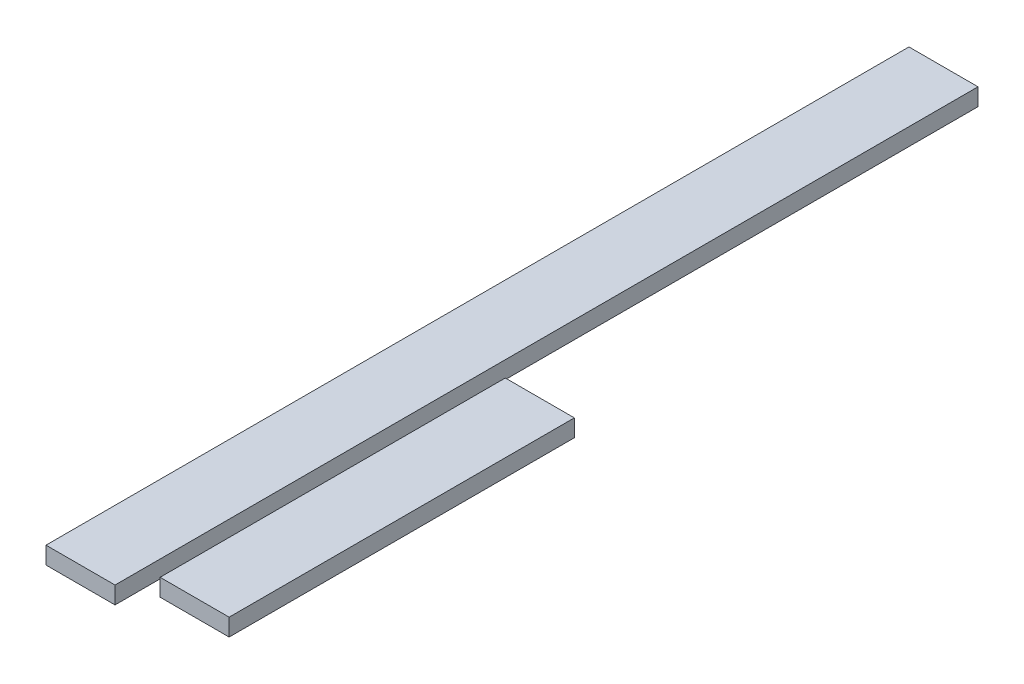
ISO-10303-21;
HEADER;
FILE_DESCRIPTION(('STEP AP214'),'2;1');
FILE_NAME('part.step','',(''),(''),'','','');
FILE_SCHEMA(('AUTOMOTIVE_DESIGN { 1 0 10303 214 1 1 1 1 }'));
ENDSEC;
DATA;
#1=APPLICATION_CONTEXT('core data for automotive mechanical design processes');
#2=APPLICATION_PROTOCOL_DEFINITION('international standard','automotive_design',2000,#1);
#3=PRODUCT_CONTEXT('',#1,'mechanical');
#4=PRODUCT('Part','Part','',(#3));
#5=PRODUCT_RELATED_PRODUCT_CATEGORY('part','',(#4));
#6=PRODUCT_DEFINITION_FORMATION('','',#4);
#7=PRODUCT_DEFINITION_CONTEXT('part definition',#1,'design');
#8=PRODUCT_DEFINITION('design','',#6,#7);
#9=PRODUCT_DEFINITION_SHAPE('','',#8);
#10=(LENGTH_UNIT() NAMED_UNIT(*) SI_UNIT(.MILLI.,.METRE.));
#11=(NAMED_UNIT(*) PLANE_ANGLE_UNIT() SI_UNIT($,.RADIAN.));
#12=(NAMED_UNIT(*) SI_UNIT($,.STERADIAN.) SOLID_ANGLE_UNIT());
#13=UNCERTAINTY_MEASURE_WITH_UNIT(LENGTH_MEASURE(1.E-05),#10,'distance_accuracy_value','');
#14=(GEOMETRIC_REPRESENTATION_CONTEXT(3) GLOBAL_UNCERTAINTY_ASSIGNED_CONTEXT((#13)) GLOBAL_UNIT_ASSIGNED_CONTEXT((#10,
#11,#12)) REPRESENTATION_CONTEXT('',''));
#15=CARTESIAN_POINT('',(0.,0.,0.));
#16=DIRECTION('',(0.,0.,1.));
#17=DIRECTION('',(1.,0.,0.));
#18=AXIS2_PLACEMENT_3D('',#15,#16,#17);
#19=CARTESIAN_POINT('',(72.5920918701177,3.,-81.6506583305544));
#20=DIRECTION('',(1.,0.,0.));
#21=DIRECTION('',(0.,0.,-1.));
#22=AXIS2_PLACEMENT_3D('',#19,#20,#21);
#23=PLANE('',#22);
#24=DIRECTION('',(0.,0.,1.));
#25=VECTOR('',#24,1.);
#26=CARTESIAN_POINT('',(72.5920918701177,0.,-81.6506583305544));
#27=LINE('',#26,#25);
#28=CARTESIAN_POINT('',(72.5920918701177,0.,-81.6506583305544));
#29=VERTEX_POINT('',#28);
#30=CARTESIAN_POINT('',(72.5920918701177,0.,-21.6506583305544));
#31=VERTEX_POINT('',#30);
#32=EDGE_CURVE('E106',#29,#31,#27,.T.);
#33=ORIENTED_EDGE('',*,*,#32,.T.);
#34=DIRECTION('',(0.,-1.,0.));
#35=VECTOR('',#34,1.);
#36=CARTESIAN_POINT('',(72.5920918701177,3.,-21.6506583305544));
#37=LINE('',#36,#35);
#38=CARTESIAN_POINT('',(72.5920918701177,3.,-21.6506583305544));
#39=VERTEX_POINT('',#38);
#40=EDGE_CURVE('E12',#39,#31,#37,.T.);
#41=ORIENTED_EDGE('',*,*,#40,.F.);
#42=DIRECTION('',(0.,0.,1.));
#43=VECTOR('',#42,1.);
#44=CARTESIAN_POINT('',(72.5920918701177,3.,-81.6506583305544));
#45=LINE('',#44,#43);
#46=CARTESIAN_POINT('',(72.5920918701177,3.,-81.6506583305544));
#47=VERTEX_POINT('',#46);
#48=EDGE_CURVE('E94',#47,#39,#45,.T.);
#49=ORIENTED_EDGE('',*,*,#48,.F.);
#50=DIRECTION('',(0.,-1.,0.));
#51=VECTOR('',#50,1.);
#52=CARTESIAN_POINT('',(72.5920918701177,3.,-81.6506583305544));
#53=LINE('',#52,#51);
#54=EDGE_CURVE('E102',#47,#29,#53,.T.);
#55=ORIENTED_EDGE('',*,*,#54,.T.);
#56=EDGE_LOOP('',(#33,#41,#49,#55));
#57=FACE_BOUND('',#56,.T.);
#58=ADVANCED_FACE('F43',(#57),#23,.F.);
#59=CARTESIAN_POINT('',(72.5920918701177,3.,-21.6506583305544));
#60=DIRECTION('',(0.,0.,-1.));
#61=DIRECTION('',(-1.,0.,0.));
#62=AXIS2_PLACEMENT_3D('',#59,#60,#61);
#63=PLANE('',#62);
#64=DIRECTION('',(1.,0.,0.));
#65=VECTOR('',#64,1.);
#66=CARTESIAN_POINT('',(72.5920918701177,0.,-21.6506583305544));
#67=LINE('',#66,#65);
#68=CARTESIAN_POINT('',(84.5920918701177,0.,-21.6506583305544));
#69=VERTEX_POINT('',#68);
#70=EDGE_CURVE('E98',#31,#69,#67,.T.);
#71=ORIENTED_EDGE('',*,*,#70,.T.);
#72=DIRECTION('',(0.,-1.,0.));
#73=VECTOR('',#72,1.);
#74=CARTESIAN_POINT('',(84.5920918701177,3.,-21.6506583305544));
#75=LINE('',#74,#73);
#76=CARTESIAN_POINT('',(84.5920918701177,3.,-21.6506583305544));
#77=VERTEX_POINT('',#76);
#78=EDGE_CURVE('E51',#77,#69,#75,.T.);
#79=ORIENTED_EDGE('',*,*,#78,.F.);
#80=DIRECTION('',(1.,0.,0.));
#81=VECTOR('',#80,1.);
#82=CARTESIAN_POINT('',(72.5920918701177,3.,-21.6506583305544));
#83=LINE('',#82,#81);
#84=EDGE_CURVE('E89',#39,#77,#83,.T.);
#85=ORIENTED_EDGE('',*,*,#84,.F.);
#86=ORIENTED_EDGE('',*,*,#40,.T.);
#87=EDGE_LOOP('',(#71,#79,#85,#86));
#88=FACE_BOUND('',#87,.T.);
#89=ADVANCED_FACE('F97',(#88),#63,.F.);
#90=CARTESIAN_POINT('',(84.5920918701177,3.,-81.6506583305544));
#91=DIRECTION('',(-1.,0.,0.));
#92=DIRECTION('',(0.,0.,1.));
#93=AXIS2_PLACEMENT_3D('',#90,#91,#92);
#94=PLANE('',#93);
#95=DIRECTION('',(0.,0.,-1.));
#96=VECTOR('',#95,1.);
#97=CARTESIAN_POINT('',(84.5920918701177,0.,-81.6506583305544));
#98=LINE('',#97,#96);
#99=CARTESIAN_POINT('',(84.5920918701177,0.,-81.6506583305544));
#100=VERTEX_POINT('',#99);
#101=EDGE_CURVE('E76',#69,#100,#98,.T.);
#102=ORIENTED_EDGE('',*,*,#101,.T.);
#103=DIRECTION('',(0.,-1.,0.));
#104=VECTOR('',#103,1.);
#105=CARTESIAN_POINT('',(84.5920918701177,3.,-81.6506583305544));
#106=LINE('',#105,#104);
#107=CARTESIAN_POINT('',(84.5920918701177,3.,-81.6506583305544));
#108=VERTEX_POINT('',#107);
#109=EDGE_CURVE('E99',#108,#100,#106,.T.);
#110=ORIENTED_EDGE('',*,*,#109,.F.);
#111=DIRECTION('',(0.,0.,-1.));
#112=VECTOR('',#111,1.);
#113=CARTESIAN_POINT('',(84.5920918701177,3.,-81.6506583305544));
#114=LINE('',#113,#112);
#115=EDGE_CURVE('E92',#77,#108,#114,.T.);
#116=ORIENTED_EDGE('',*,*,#115,.F.);
#117=ORIENTED_EDGE('',*,*,#78,.T.);
#118=EDGE_LOOP('',(#102,#110,#116,#117));
#119=FACE_BOUND('',#118,.T.);
#120=ADVANCED_FACE('F100',(#119),#94,.F.);
#121=CARTESIAN_POINT('',(72.5920918701177,3.,-81.6506583305544));
#122=DIRECTION('',(0.,0.,1.));
#123=DIRECTION('',(1.,0.,0.));
#124=AXIS2_PLACEMENT_3D('',#121,#122,#123);
#125=PLANE('',#124);
#126=DIRECTION('',(-1.,0.,0.));
#127=VECTOR('',#126,1.);
#128=CARTESIAN_POINT('',(72.5920918701177,0.,-81.6506583305544));
#129=LINE('',#128,#127);
#130=EDGE_CURVE('E82',#100,#29,#129,.T.);
#131=ORIENTED_EDGE('',*,*,#130,.T.);
#132=ORIENTED_EDGE('',*,*,#54,.F.);
#133=DIRECTION('',(-1.,0.,0.));
#134=VECTOR('',#133,1.);
#135=CARTESIAN_POINT('',(72.5920918701177,3.,-81.6506583305544));
#136=LINE('',#135,#134);
#137=EDGE_CURVE('E59',#108,#47,#136,.T.);
#138=ORIENTED_EDGE('',*,*,#137,.F.);
#139=ORIENTED_EDGE('',*,*,#109,.T.);
#140=EDGE_LOOP('',(#131,#132,#138,#139));
#141=FACE_BOUND('',#140,.T.);
#142=ADVANCED_FACE('F113',(#141),#125,.F.);
#143=CARTESIAN_POINT('',(-21.0374683043508,3.,-8.38383851009602));
#144=DIRECTION('',(0.,1.,0.));
#145=DIRECTION('',(0.,0.,1.));
#146=AXIS2_PLACEMENT_3D('',#143,#144,#145);
#147=PLANE('',#146);
#148=ORIENTED_EDGE('',*,*,#48,.T.);
#149=ORIENTED_EDGE('',*,*,#84,.T.);
#150=ORIENTED_EDGE('',*,*,#115,.T.);
#151=ORIENTED_EDGE('',*,*,#137,.T.);
#152=EDGE_LOOP('',(#148,#149,#150,#151));
#153=FACE_BOUND('',#152,.T.);
#154=ADVANCED_FACE('F90',(#153),#147,.T.);
#155=CARTESIAN_POINT('',(-21.0374683043508,0.,-8.38383851009602));
#156=DIRECTION('',(0.,1.,0.));
#157=DIRECTION('',(0.,0.,1.));
#158=AXIS2_PLACEMENT_3D('',#155,#156,#157);
#159=PLANE('',#158);
#160=ORIENTED_EDGE('',*,*,#32,.F.);
#161=ORIENTED_EDGE('',*,*,#130,.F.);
#162=ORIENTED_EDGE('',*,*,#101,.F.);
#163=ORIENTED_EDGE('',*,*,#70,.F.);
#164=EDGE_LOOP('',(#160,#161,#162,#163));
#165=FACE_BOUND('',#164,.T.);
#166=ADVANCED_FACE('F116',(#165),#159,.F.);
#167=CLOSED_SHELL('',(#58,#89,#120,#142,#154,#166));
#168=MANIFOLD_SOLID_BREP('B2',#167);
#169=CARTESIAN_POINT('',(57.8362578566196,3.,-166.571847269674));
#170=DIRECTION('',(1.,0.,0.));
#171=DIRECTION('',(0.,0.,-1.));
#172=AXIS2_PLACEMENT_3D('',#169,#170,#171);
#173=PLANE('',#172);
#174=DIRECTION('',(0.,0.,1.));
#175=VECTOR('',#174,1.);
#176=CARTESIAN_POINT('',(57.8362578566196,0.,-166.571847269674));
#177=LINE('',#176,#175);
#178=CARTESIAN_POINT('',(57.8362578566196,0.,-166.571847269674));
#179=VERTEX_POINT('',#178);
#180=CARTESIAN_POINT('',(57.8362578566196,0.,-16.5718472696739));
#181=VERTEX_POINT('',#180);
#182=EDGE_CURVE('E230',#179,#181,#177,.T.);
#183=ORIENTED_EDGE('',*,*,#182,.T.);
#184=DIRECTION('',(0.,-1.,0.));
#185=VECTOR('',#184,1.);
#186=CARTESIAN_POINT('',(57.8362578566196,3.,-16.5718472696739));
#187=LINE('',#186,#185);
#188=CARTESIAN_POINT('',(57.8362578566196,3.,-16.5718472696739));
#189=VERTEX_POINT('',#188);
#190=EDGE_CURVE('E41',#189,#181,#187,.T.);
#191=ORIENTED_EDGE('',*,*,#190,.F.);
#192=DIRECTION('',(0.,0.,1.));
#193=VECTOR('',#192,1.);
#194=CARTESIAN_POINT('',(57.8362578566196,3.,-166.571847269674));
#195=LINE('',#194,#193);
#196=CARTESIAN_POINT('',(57.8362578566196,3.,-166.571847269674));
#197=VERTEX_POINT('',#196);
#198=EDGE_CURVE('E218',#197,#189,#195,.T.);
#199=ORIENTED_EDGE('',*,*,#198,.F.);
#200=DIRECTION('',(0.,-1.,0.));
#201=VECTOR('',#200,1.);
#202=CARTESIAN_POINT('',(57.8362578566196,3.,-166.571847269674));
#203=LINE('',#202,#201);
#204=EDGE_CURVE('E226',#197,#179,#203,.T.);
#205=ORIENTED_EDGE('',*,*,#204,.T.);
#206=EDGE_LOOP('',(#183,#191,#199,#205));
#207=FACE_BOUND('',#206,.T.);
#208=ADVANCED_FACE('F167',(#207),#173,.F.);
#209=CARTESIAN_POINT('',(57.8362578566196,3.,-16.5718472696739));
#210=DIRECTION('',(0.,0.,-1.));
#211=DIRECTION('',(-1.,0.,0.));
#212=AXIS2_PLACEMENT_3D('',#209,#210,#211);
#213=PLANE('',#212);
#214=DIRECTION('',(1.,0.,0.));
#215=VECTOR('',#214,1.);
#216=CARTESIAN_POINT('',(57.8362578566196,0.,-16.5718472696739));
#217=LINE('',#216,#215);
#218=CARTESIAN_POINT('',(69.8362578566196,0.,-16.5718472696739));
#219=VERTEX_POINT('',#218);
#220=EDGE_CURVE('E222',#181,#219,#217,.T.);
#221=ORIENTED_EDGE('',*,*,#220,.T.);
#222=DIRECTION('',(0.,-1.,0.));
#223=VECTOR('',#222,1.);
#224=CARTESIAN_POINT('',(69.8362578566196,3.,-16.5718472696739));
#225=LINE('',#224,#223);
#226=CARTESIAN_POINT('',(69.8362578566196,3.,-16.5718472696739));
#227=VERTEX_POINT('',#226);
#228=EDGE_CURVE('E175',#227,#219,#225,.T.);
#229=ORIENTED_EDGE('',*,*,#228,.F.);
#230=DIRECTION('',(1.,0.,0.));
#231=VECTOR('',#230,1.);
#232=CARTESIAN_POINT('',(57.8362578566196,3.,-16.5718472696739));
#233=LINE('',#232,#231);
#234=EDGE_CURVE('E213',#189,#227,#233,.T.);
#235=ORIENTED_EDGE('',*,*,#234,.F.);
#236=ORIENTED_EDGE('',*,*,#190,.T.);
#237=EDGE_LOOP('',(#221,#229,#235,#236));
#238=FACE_BOUND('',#237,.T.);
#239=ADVANCED_FACE('F221',(#238),#213,.F.);
#240=CARTESIAN_POINT('',(69.8362578566196,3.,-166.571847269674));
#241=DIRECTION('',(-1.,0.,0.));
#242=DIRECTION('',(0.,0.,1.));
#243=AXIS2_PLACEMENT_3D('',#240,#241,#242);
#244=PLANE('',#243);
#245=DIRECTION('',(0.,0.,-1.));
#246=VECTOR('',#245,1.);
#247=CARTESIAN_POINT('',(69.8362578566196,0.,-166.571847269674));
#248=LINE('',#247,#246);
#249=CARTESIAN_POINT('',(69.8362578566196,0.,-166.571847269674));
#250=VERTEX_POINT('',#249);
#251=EDGE_CURVE('E200',#219,#250,#248,.T.);
#252=ORIENTED_EDGE('',*,*,#251,.T.);
#253=DIRECTION('',(0.,-1.,0.));
#254=VECTOR('',#253,1.);
#255=CARTESIAN_POINT('',(69.8362578566196,3.,-166.571847269674));
#256=LINE('',#255,#254);
#257=CARTESIAN_POINT('',(69.8362578566196,3.,-166.571847269674));
#258=VERTEX_POINT('',#257);
#259=EDGE_CURVE('E223',#258,#250,#256,.T.);
#260=ORIENTED_EDGE('',*,*,#259,.F.);
#261=DIRECTION('',(0.,0.,-1.));
#262=VECTOR('',#261,1.);
#263=CARTESIAN_POINT('',(69.8362578566196,3.,-166.571847269674));
#264=LINE('',#263,#262);
#265=EDGE_CURVE('E216',#227,#258,#264,.T.);
#266=ORIENTED_EDGE('',*,*,#265,.F.);
#267=ORIENTED_EDGE('',*,*,#228,.T.);
#268=EDGE_LOOP('',(#252,#260,#266,#267));
#269=FACE_BOUND('',#268,.T.);
#270=ADVANCED_FACE('F224',(#269),#244,.F.);
#271=CARTESIAN_POINT('',(57.8362578566196,3.,-166.571847269674));
#272=DIRECTION('',(0.,0.,1.));
#273=DIRECTION('',(1.,0.,0.));
#274=AXIS2_PLACEMENT_3D('',#271,#272,#273);
#275=PLANE('',#274);
#276=DIRECTION('',(-1.,0.,0.));
#277=VECTOR('',#276,1.);
#278=CARTESIAN_POINT('',(57.8362578566196,0.,-166.571847269674));
#279=LINE('',#278,#277);
#280=EDGE_CURVE('E206',#250,#179,#279,.T.);
#281=ORIENTED_EDGE('',*,*,#280,.T.);
#282=ORIENTED_EDGE('',*,*,#204,.F.);
#283=DIRECTION('',(-1.,0.,0.));
#284=VECTOR('',#283,1.);
#285=CARTESIAN_POINT('',(57.8362578566196,3.,-166.571847269674));
#286=LINE('',#285,#284);
#287=EDGE_CURVE('E183',#258,#197,#286,.T.);
#288=ORIENTED_EDGE('',*,*,#287,.F.);
#289=ORIENTED_EDGE('',*,*,#259,.T.);
#290=EDGE_LOOP('',(#281,#282,#288,#289));
#291=FACE_BOUND('',#290,.T.);
#292=ADVANCED_FACE('F237',(#291),#275,.F.);
#293=CARTESIAN_POINT('',(0.,3.,0.));
#294=DIRECTION('',(0.,1.,0.));
#295=DIRECTION('',(0.,0.,1.));
#296=AXIS2_PLACEMENT_3D('',#293,#294,#295);
#297=PLANE('',#296);
#298=ORIENTED_EDGE('',*,*,#198,.T.);
#299=ORIENTED_EDGE('',*,*,#234,.T.);
#300=ORIENTED_EDGE('',*,*,#265,.T.);
#301=ORIENTED_EDGE('',*,*,#287,.T.);
#302=EDGE_LOOP('',(#298,#299,#300,#301));
#303=FACE_BOUND('',#302,.T.);
#304=ADVANCED_FACE('F214',(#303),#297,.T.);
#305=CARTESIAN_POINT('',(0.,0.,0.));
#306=DIRECTION('',(0.,1.,0.));
#307=DIRECTION('',(0.,0.,1.));
#308=AXIS2_PLACEMENT_3D('',#305,#306,#307);
#309=PLANE('',#308);
#310=ORIENTED_EDGE('',*,*,#182,.F.);
#311=ORIENTED_EDGE('',*,*,#280,.F.);
#312=ORIENTED_EDGE('',*,*,#251,.F.);
#313=ORIENTED_EDGE('',*,*,#220,.F.);
#314=EDGE_LOOP('',(#310,#311,#312,#313));
#315=FACE_BOUND('',#314,.T.);
#316=ADVANCED_FACE('F240',(#315),#309,.F.);
#317=CLOSED_SHELL('',(#208,#239,#270,#292,#304,#316));
#318=MANIFOLD_SOLID_BREP('B6',#317);
#319=ADVANCED_BREP_SHAPE_REPRESENTATION('',(#18,#168,#318),#14);
#320=SHAPE_DEFINITION_REPRESENTATION(#9,#319);
ENDSEC;
END-ISO-10303-21;
